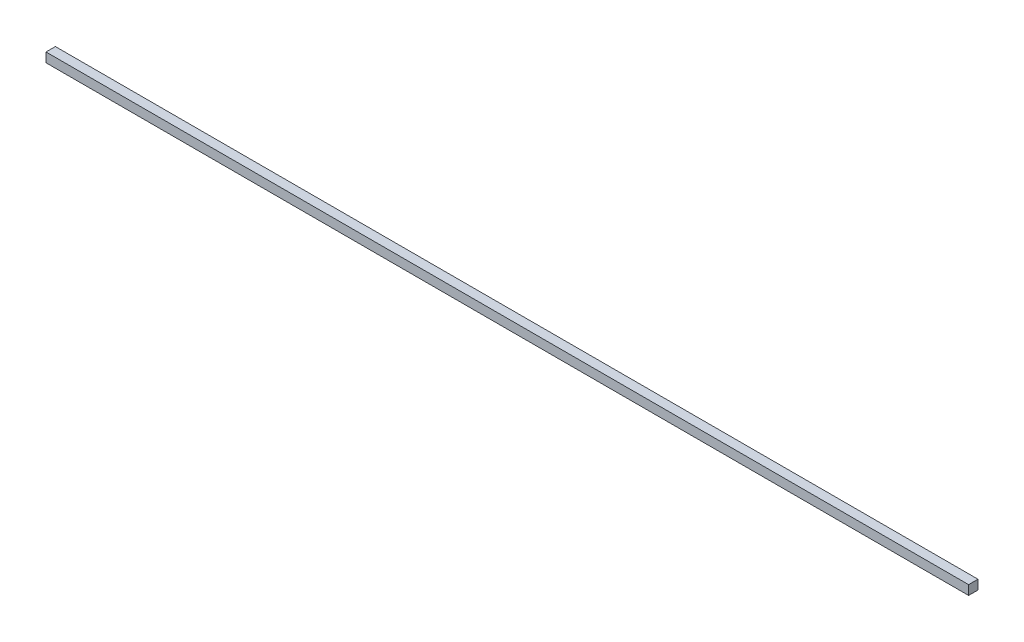
ISO-10303-21;
HEADER;
FILE_DESCRIPTION(('STEP AP214'),'2;1');
FILE_NAME('part.step','',(''),(''),'','','');
FILE_SCHEMA(('AUTOMOTIVE_DESIGN { 1 0 10303 214 1 1 1 1 }'));
ENDSEC;
DATA;
#1=APPLICATION_CONTEXT('core data for automotive mechanical design processes');
#2=APPLICATION_PROTOCOL_DEFINITION('international standard','automotive_design',2000,#1);
#3=PRODUCT_CONTEXT('',#1,'mechanical');
#4=PRODUCT('Part','Part','',(#3));
#5=PRODUCT_RELATED_PRODUCT_CATEGORY('part','',(#4));
#6=PRODUCT_DEFINITION_FORMATION('','',#4);
#7=PRODUCT_DEFINITION_CONTEXT('part definition',#1,'design');
#8=PRODUCT_DEFINITION('design','',#6,#7);
#9=PRODUCT_DEFINITION_SHAPE('','',#8);
#10=(LENGTH_UNIT() NAMED_UNIT(*) SI_UNIT(.MILLI.,.METRE.));
#11=(NAMED_UNIT(*) PLANE_ANGLE_UNIT() SI_UNIT($,.RADIAN.));
#12=(NAMED_UNIT(*) SI_UNIT($,.STERADIAN.) SOLID_ANGLE_UNIT());
#13=UNCERTAINTY_MEASURE_WITH_UNIT(LENGTH_MEASURE(1.E-05),#10,'distance_accuracy_value','');
#14=(GEOMETRIC_REPRESENTATION_CONTEXT(3) GLOBAL_UNCERTAINTY_ASSIGNED_CONTEXT((#13)) GLOBAL_UNIT_ASSIGNED_CONTEXT((#10,
#11,#12)) REPRESENTATION_CONTEXT('',''));
#15=CARTESIAN_POINT('',(0.,0.,0.));
#16=DIRECTION('',(0.,0.,1.));
#17=DIRECTION('',(1.,0.,0.));
#18=AXIS2_PLACEMENT_3D('',#15,#16,#17);
#19=CARTESIAN_POINT('',(312.1,1.5875,-1.5875));
#20=DIRECTION('',(0.,0.,1.));
#21=DIRECTION('',(0.,-1.,0.));
#22=AXIS2_PLACEMENT_3D('',#19,#20,#21);
#23=PLANE('',#22);
#24=DIRECTION('',(0.,1.,0.));
#25=VECTOR('',#24,1.);
#26=CARTESIAN_POINT('',(0.,1.5875,-1.5875));
#27=LINE('',#26,#25);
#28=CARTESIAN_POINT('',(0.,-1.5875,-1.5875));
#29=VERTEX_POINT('',#28);
#30=CARTESIAN_POINT('',(0.,1.5875,-1.5875));
#31=VERTEX_POINT('',#30);
#32=EDGE_CURVE('E105',#29,#31,#27,.T.);
#33=ORIENTED_EDGE('',*,*,#32,.T.);
#34=DIRECTION('',(-1.,0.,0.));
#35=VECTOR('',#34,1.);
#36=CARTESIAN_POINT('',(312.1,1.5875,-1.5875));
#37=LINE('',#36,#35);
#38=CARTESIAN_POINT('',(312.1,1.5875,-1.5875));
#39=VERTEX_POINT('',#38);
#40=EDGE_CURVE('E11',#39,#31,#37,.T.);
#41=ORIENTED_EDGE('',*,*,#40,.F.);
#42=DIRECTION('',(0.,1.,0.));
#43=VECTOR('',#42,1.);
#44=CARTESIAN_POINT('',(312.1,1.5875,-1.5875));
#45=LINE('',#44,#43);
#46=CARTESIAN_POINT('',(312.1,-1.5875,-1.5875));
#47=VERTEX_POINT('',#46);
#48=EDGE_CURVE('E89',#47,#39,#45,.T.);
#49=ORIENTED_EDGE('',*,*,#48,.F.);
#50=DIRECTION('',(-1.,0.,0.));
#51=VECTOR('',#50,1.);
#52=CARTESIAN_POINT('',(312.1,-1.5875,-1.5875));
#53=LINE('',#52,#51);
#54=EDGE_CURVE('E98',#47,#29,#53,.T.);
#55=ORIENTED_EDGE('',*,*,#54,.T.);
#56=EDGE_LOOP('',(#33,#41,#49,#55));
#57=FACE_BOUND('',#56,.T.);
#58=ADVANCED_FACE('F39',(#57),#23,.F.);
#59=CARTESIAN_POINT('',(312.1,1.5875,1.5875));
#60=DIRECTION('',(0.,-1.,0.));
#61=DIRECTION('',(0.,0.,-1.));
#62=AXIS2_PLACEMENT_3D('',#59,#60,#61);
#63=PLANE('',#62);
#64=DIRECTION('',(0.,0.,1.));
#65=VECTOR('',#64,1.);
#66=CARTESIAN_POINT('',(0.,1.5875,1.5875));
#67=LINE('',#66,#65);
#68=CARTESIAN_POINT('',(0.,1.5875,1.5875));
#69=VERTEX_POINT('',#68);
#70=EDGE_CURVE('E94',#31,#69,#67,.T.);
#71=ORIENTED_EDGE('',*,*,#70,.T.);
#72=DIRECTION('',(-1.,0.,0.));
#73=VECTOR('',#72,1.);
#74=CARTESIAN_POINT('',(312.1,1.5875,1.5875));
#75=LINE('',#74,#73);
#76=CARTESIAN_POINT('',(312.1,1.5875,1.5875));
#77=VERTEX_POINT('',#76);
#78=EDGE_CURVE('E50',#77,#69,#75,.T.);
#79=ORIENTED_EDGE('',*,*,#78,.F.);
#80=DIRECTION('',(0.,0.,1.));
#81=VECTOR('',#80,1.);
#82=CARTESIAN_POINT('',(312.1,1.5875,1.5875));
#83=LINE('',#82,#81);
#84=EDGE_CURVE('E85',#39,#77,#83,.T.);
#85=ORIENTED_EDGE('',*,*,#84,.F.);
#86=ORIENTED_EDGE('',*,*,#40,.T.);
#87=EDGE_LOOP('',(#71,#79,#85,#86));
#88=FACE_BOUND('',#87,.T.);
#89=ADVANCED_FACE('F91',(#88),#63,.F.);
#90=CARTESIAN_POINT('',(312.1,1.5875,1.5875));
#91=DIRECTION('',(0.,0.,-1.));
#92=DIRECTION('',(0.,1.,0.));
#93=AXIS2_PLACEMENT_3D('',#90,#91,#92);
#94=PLANE('',#93);
#95=DIRECTION('',(0.,-1.,0.));
#96=VECTOR('',#95,1.);
#97=CARTESIAN_POINT('',(0.,1.5875,1.5875));
#98=LINE('',#97,#96);
#99=CARTESIAN_POINT('',(0.,-1.5875,1.5875));
#100=VERTEX_POINT('',#99);
#101=EDGE_CURVE('E75',#69,#100,#98,.T.);
#102=ORIENTED_EDGE('',*,*,#101,.T.);
#103=DIRECTION('',(-1.,0.,0.));
#104=VECTOR('',#103,1.);
#105=CARTESIAN_POINT('',(312.1,-1.5875,1.5875));
#106=LINE('',#105,#104);
#107=CARTESIAN_POINT('',(312.1,-1.5875,1.5875));
#108=VERTEX_POINT('',#107);
#109=EDGE_CURVE('E92',#108,#100,#106,.T.);
#110=ORIENTED_EDGE('',*,*,#109,.F.);
#111=DIRECTION('',(0.,-1.,0.));
#112=VECTOR('',#111,1.);
#113=CARTESIAN_POINT('',(312.1,1.5875,1.5875));
#114=LINE('',#113,#112);
#115=EDGE_CURVE('E86',#77,#108,#114,.T.);
#116=ORIENTED_EDGE('',*,*,#115,.F.);
#117=ORIENTED_EDGE('',*,*,#78,.T.);
#118=EDGE_LOOP('',(#102,#110,#116,#117));
#119=FACE_BOUND('',#118,.T.);
#120=ADVANCED_FACE('F96',(#119),#94,.F.);
#121=CARTESIAN_POINT('',(312.1,-1.5875,1.5875));
#122=DIRECTION('',(0.,1.,0.));
#123=DIRECTION('',(0.,0.,1.));
#124=AXIS2_PLACEMENT_3D('',#121,#122,#123);
#125=PLANE('',#124);
#126=DIRECTION('',(0.,0.,-1.));
#127=VECTOR('',#126,1.);
#128=CARTESIAN_POINT('',(0.,-1.5875,1.5875));
#129=LINE('',#128,#127);
#130=EDGE_CURVE('E79',#100,#29,#129,.T.);
#131=ORIENTED_EDGE('',*,*,#130,.T.);
#132=ORIENTED_EDGE('',*,*,#54,.F.);
#133=DIRECTION('',(0.,0.,-1.));
#134=VECTOR('',#133,1.);
#135=CARTESIAN_POINT('',(312.1,-1.5875,1.5875));
#136=LINE('',#135,#134);
#137=EDGE_CURVE('E54',#108,#47,#136,.T.);
#138=ORIENTED_EDGE('',*,*,#137,.F.);
#139=ORIENTED_EDGE('',*,*,#109,.T.);
#140=EDGE_LOOP('',(#131,#132,#138,#139));
#141=FACE_BOUND('',#140,.T.);
#142=ADVANCED_FACE('F108',(#141),#125,.F.);
#143=CARTESIAN_POINT('',(312.1,0.,0.));
#144=DIRECTION('',(1.,0.,0.));
#145=DIRECTION('',(0.,0.,-1.));
#146=AXIS2_PLACEMENT_3D('',#143,#144,#145);
#147=PLANE('',#146);
#148=ORIENTED_EDGE('',*,*,#48,.T.);
#149=ORIENTED_EDGE('',*,*,#84,.T.);
#150=ORIENTED_EDGE('',*,*,#115,.T.);
#151=ORIENTED_EDGE('',*,*,#137,.T.);
#152=EDGE_LOOP('',(#148,#149,#150,#151));
#153=FACE_BOUND('',#152,.T.);
#154=ADVANCED_FACE('F88',(#153),#147,.T.);
#155=CARTESIAN_POINT('',(0.,0.,0.));
#156=DIRECTION('',(1.,0.,0.));
#157=DIRECTION('',(0.,0.,-1.));
#158=AXIS2_PLACEMENT_3D('',#155,#156,#157);
#159=PLANE('',#158);
#160=ORIENTED_EDGE('',*,*,#32,.F.);
#161=ORIENTED_EDGE('',*,*,#130,.F.);
#162=ORIENTED_EDGE('',*,*,#101,.F.);
#163=ORIENTED_EDGE('',*,*,#70,.F.);
#164=EDGE_LOOP('',(#160,#161,#162,#163));
#165=FACE_BOUND('',#164,.T.);
#166=ADVANCED_FACE('F115',(#165),#159,.F.);
#167=CLOSED_SHELL('',(#58,#89,#120,#142,#154,#166));
#168=MANIFOLD_SOLID_BREP('B2',#167);
#169=ADVANCED_BREP_SHAPE_REPRESENTATION('',(#18,#168),#14);
#170=SHAPE_DEFINITION_REPRESENTATION(#9,#169);
ENDSEC;
END-ISO-10303-21;
